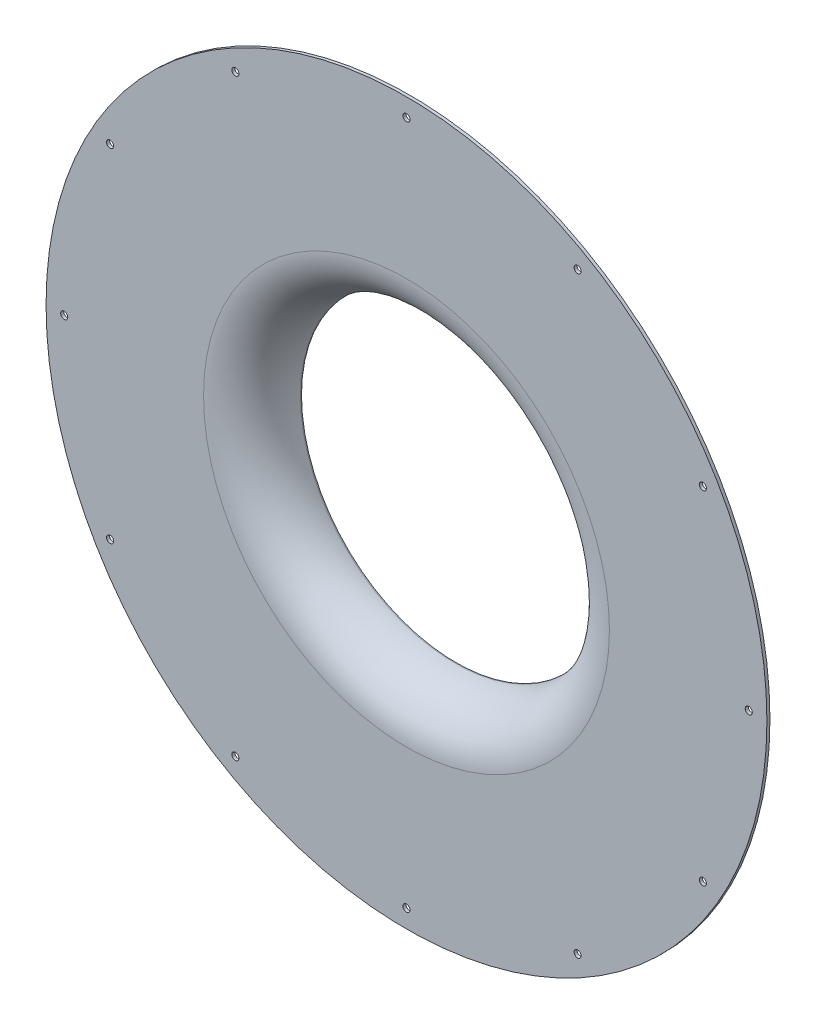
ISO-10303-21;
HEADER;
FILE_DESCRIPTION(('STEP AP214'),'2;1');
FILE_NAME('part.step','',(''),(''),'','','');
FILE_SCHEMA(('AUTOMOTIVE_DESIGN { 1 0 10303 214 1 1 1 1 }'));
ENDSEC;
DATA;
#1=APPLICATION_CONTEXT('core data for automotive mechanical design processes');
#2=APPLICATION_PROTOCOL_DEFINITION('international standard','automotive_design',2000,#1);
#3=PRODUCT_CONTEXT('',#1,'mechanical');
#4=PRODUCT('Part','Part','',(#3));
#5=PRODUCT_RELATED_PRODUCT_CATEGORY('part','',(#4));
#6=PRODUCT_DEFINITION_FORMATION('','',#4);
#7=PRODUCT_DEFINITION_CONTEXT('part definition',#1,'design');
#8=PRODUCT_DEFINITION('design','',#6,#7);
#9=PRODUCT_DEFINITION_SHAPE('','',#8);
#10=(LENGTH_UNIT() NAMED_UNIT(*) SI_UNIT(.MILLI.,.METRE.));
#11=(NAMED_UNIT(*) PLANE_ANGLE_UNIT() SI_UNIT($,.RADIAN.));
#12=(NAMED_UNIT(*) SI_UNIT($,.STERADIAN.) SOLID_ANGLE_UNIT());
#13=UNCERTAINTY_MEASURE_WITH_UNIT(LENGTH_MEASURE(1.E-05),#10,'distance_accuracy_value','');
#14=(GEOMETRIC_REPRESENTATION_CONTEXT(3) GLOBAL_UNCERTAINTY_ASSIGNED_CONTEXT((#13)) GLOBAL_UNIT_ASSIGNED_CONTEXT((#10,
#11,#12)) REPRESENTATION_CONTEXT('',''));
#15=CARTESIAN_POINT('',(0.,0.,0.));
#16=DIRECTION('',(0.,0.,1.));
#17=DIRECTION('',(1.,0.,0.));
#18=AXIS2_PLACEMENT_3D('',#15,#16,#17);
#19=CARTESIAN_POINT('',(0.,0.,-3.));
#20=DIRECTION('',(0.,0.,1.));
#21=DIRECTION('',(1.,0.,0.));
#22=AXIS2_PLACEMENT_3D('',#19,#20,#21);
#23=CYLINDRICAL_SURFACE('',#22,357.);
#24=CARTESIAN_POINT('',(0.,0.,-3.));
#25=DIRECTION('',(0.,0.,1.));
#26=DIRECTION('',(1.,0.,0.));
#27=AXIS2_PLACEMENT_3D('',#24,#25,#26);
#28=CIRCLE('',#27,357.);
#29=CARTESIAN_POINT('',(357.,0.,-3.));
#30=VERTEX_POINT('',#29);
#31=EDGE_CURVE('E104',#30,#30,#28,.T.);
#32=ORIENTED_EDGE('',*,*,#31,.T.);
#33=EDGE_LOOP('',(#32));
#34=FACE_BOUND('',#33,.T.);
#35=CARTESIAN_POINT('',(0.,0.,0.));
#36=DIRECTION('',(0.,0.,1.));
#37=DIRECTION('',(1.,0.,0.));
#38=AXIS2_PLACEMENT_3D('',#35,#36,#37);
#39=CIRCLE('',#38,357.);
#40=CARTESIAN_POINT('',(357.,0.,0.));
#41=VERTEX_POINT('',#40);
#42=EDGE_CURVE('E160',#41,#41,#39,.T.);
#43=ORIENTED_EDGE('',*,*,#42,.F.);
#44=EDGE_LOOP('',(#43));
#45=FACE_BOUND('',#44,.T.);
#46=ADVANCED_FACE('F94',(#34,#45),#23,.T.);
#47=CARTESIAN_POINT('',(0.,0.,-3.));
#48=DIRECTION('',(0.,0.,1.));
#49=DIRECTION('',(1.,0.,0.));
#50=AXIS2_PLACEMENT_3D('',#47,#48,#49);
#51=PLANE('',#50);
#52=CARTESIAN_POINT('',(-293.582611882927,169.499999999996,-3.));
#53=DIRECTION('',(0.,0.,-1.));
#54=DIRECTION('',(-1.,0.,0.));
#55=AXIS2_PLACEMENT_3D('',#52,#53,#54);
#56=CIRCLE('',#55,3.5);
#57=CARTESIAN_POINT('',(-297.082611882927,169.499999999996,-3.));
#58=VERTEX_POINT('',#57);
#59=EDGE_CURVE('E291',#58,#58,#56,.T.);
#60=ORIENTED_EDGE('',*,*,#59,.F.);
#61=EDGE_LOOP('',(#60));
#62=FACE_BOUND('',#61,.T.);
#63=CARTESIAN_POINT('',(-169.500000000003,293.582611882923,-3.));
#64=DIRECTION('',(0.,0.,-1.));
#65=DIRECTION('',(-1.,0.,0.));
#66=AXIS2_PLACEMENT_3D('',#63,#64,#65);
#67=CIRCLE('',#66,3.5);
#68=CARTESIAN_POINT('',(-173.000000000003,293.582611882923,-3.));
#69=VERTEX_POINT('',#68);
#70=EDGE_CURVE('E295',#69,#69,#67,.T.);
#71=ORIENTED_EDGE('',*,*,#70,.F.);
#72=EDGE_LOOP('',(#71));
#73=FACE_BOUND('',#72,.T.);
#74=CARTESIAN_POINT('',(-3.55083857824824E-12,339.,-3.));
#75=DIRECTION('',(0.,0.,-1.));
#76=DIRECTION('',(-1.,0.,0.));
#77=AXIS2_PLACEMENT_3D('',#74,#75,#76);
#78=CIRCLE('',#77,3.49999999999999);
#79=CARTESIAN_POINT('',(-3.50000000000354,339.,-3.));
#80=VERTEX_POINT('',#79);
#81=EDGE_CURVE('E305',#80,#80,#78,.T.);
#82=ORIENTED_EDGE('',*,*,#81,.F.);
#83=EDGE_LOOP('',(#82));
#84=FACE_BOUND('',#83,.T.);
#85=CARTESIAN_POINT('',(169.499999999997,293.582611882926,-3.));
#86=DIRECTION('',(0.,0.,-1.));
#87=DIRECTION('',(-1.,0.,0.));
#88=AXIS2_PLACEMENT_3D('',#85,#86,#87);
#89=CIRCLE('',#88,3.49999999999998);
#90=CARTESIAN_POINT('',(165.999999999997,293.582611882926,-3.));
#91=VERTEX_POINT('',#90);
#92=EDGE_CURVE('E313',#91,#91,#89,.T.);
#93=ORIENTED_EDGE('',*,*,#92,.F.);
#94=EDGE_LOOP('',(#93));
#95=FACE_BOUND('',#94,.T.);
#96=CARTESIAN_POINT('',(293.582611882923,169.500000000002,-3.));
#97=DIRECTION('',(0.,0.,-1.));
#98=DIRECTION('',(-1.,0.,0.));
#99=AXIS2_PLACEMENT_3D('',#96,#97,#98);
#100=CIRCLE('',#99,3.5);
#101=CARTESIAN_POINT('',(290.082611882923,169.500000000002,-3.));
#102=VERTEX_POINT('',#101);
#103=EDGE_CURVE('E321',#102,#102,#100,.T.);
#104=ORIENTED_EDGE('',*,*,#103,.F.);
#105=EDGE_LOOP('',(#104));
#106=FACE_BOUND('',#105,.T.);
#107=CARTESIAN_POINT('',(339.,0.,-3.));
#108=DIRECTION('',(0.,0.,-1.));
#109=DIRECTION('',(-1.,0.,0.));
#110=AXIS2_PLACEMENT_3D('',#107,#108,#109);
#111=CIRCLE('',#110,3.5);
#112=CARTESIAN_POINT('',(335.5,0.,-3.));
#113=VERTEX_POINT('',#112);
#114=EDGE_CURVE('E329',#113,#113,#111,.T.);
#115=ORIENTED_EDGE('',*,*,#114,.F.);
#116=EDGE_LOOP('',(#115));
#117=FACE_BOUND('',#116,.T.);
#118=CARTESIAN_POINT('',(293.582611882926,-169.499999999998,-3.));
#119=DIRECTION('',(0.,0.,-1.));
#120=DIRECTION('',(-1.,0.,0.));
#121=AXIS2_PLACEMENT_3D('',#118,#119,#120);
#122=CIRCLE('',#121,3.5);
#123=CARTESIAN_POINT('',(290.082611882926,-169.499999999998,-3.));
#124=VERTEX_POINT('',#123);
#125=EDGE_CURVE('E337',#124,#124,#122,.T.);
#126=ORIENTED_EDGE('',*,*,#125,.F.);
#127=EDGE_LOOP('',(#126));
#128=FACE_BOUND('',#127,.T.);
#129=CARTESIAN_POINT('',(169.500000000001,-293.582611882924,-3.));
#130=DIRECTION('',(0.,0.,-1.));
#131=DIRECTION('',(-1.,0.,0.));
#132=AXIS2_PLACEMENT_3D('',#129,#130,#131);
#133=CIRCLE('',#132,3.49999999999998);
#134=CARTESIAN_POINT('',(166.000000000001,-293.582611882924,-3.));
#135=VERTEX_POINT('',#134);
#136=EDGE_CURVE('E345',#135,#135,#133,.T.);
#137=ORIENTED_EDGE('',*,*,#136,.F.);
#138=EDGE_LOOP('',(#137));
#139=FACE_BOUND('',#138,.T.);
#140=CARTESIAN_POINT('',(1.18361285941608E-12,-339.,-3.));
#141=DIRECTION('',(0.,0.,-1.));
#142=DIRECTION('',(-1.,0.,0.));
#143=AXIS2_PLACEMENT_3D('',#140,#141,#142);
#144=CIRCLE('',#143,3.49999999999999);
#145=CARTESIAN_POINT('',(-3.49999999999881,-339.,-3.));
#146=VERTEX_POINT('',#145);
#147=EDGE_CURVE('E353',#146,#146,#144,.T.);
#148=ORIENTED_EDGE('',*,*,#147,.F.);
#149=EDGE_LOOP('',(#148));
#150=FACE_BOUND('',#149,.T.);
#151=CARTESIAN_POINT('',(-169.499999999999,-293.582611882925,-3.));
#152=DIRECTION('',(0.,0.,-1.));
#153=DIRECTION('',(-1.,0.,0.));
#154=AXIS2_PLACEMENT_3D('',#151,#152,#153);
#155=CIRCLE('',#154,3.49999999999998);
#156=CARTESIAN_POINT('',(-172.999999999999,-293.582611882925,-3.));
#157=VERTEX_POINT('',#156);
#158=EDGE_CURVE('E361',#157,#157,#155,.T.);
#159=ORIENTED_EDGE('',*,*,#158,.F.);
#160=EDGE_LOOP('',(#159));
#161=FACE_BOUND('',#160,.T.);
#162=CARTESIAN_POINT('',(-293.582611882924,-169.5,-3.));
#163=DIRECTION('',(0.,0.,-1.));
#164=DIRECTION('',(-1.,0.,0.));
#165=AXIS2_PLACEMENT_3D('',#162,#163,#164);
#166=CIRCLE('',#165,3.5);
#167=CARTESIAN_POINT('',(-297.082611882924,-169.5,-3.));
#168=VERTEX_POINT('',#167);
#169=EDGE_CURVE('E189',#168,#168,#166,.T.);
#170=ORIENTED_EDGE('',*,*,#169,.F.);
#171=EDGE_LOOP('',(#170));
#172=FACE_BOUND('',#171,.T.);
#173=CARTESIAN_POINT('',(-339.,0.,-3.));
#174=DIRECTION('',(0.,0.,-1.));
#175=DIRECTION('',(-1.,0.,0.));
#176=AXIS2_PLACEMENT_3D('',#173,#174,#175);
#177=CIRCLE('',#176,3.5);
#178=CARTESIAN_POINT('',(-342.5,0.,-3.));
#179=VERTEX_POINT('',#178);
#180=EDGE_CURVE('E179',#179,#179,#177,.T.);
#181=ORIENTED_EDGE('',*,*,#180,.F.);
#182=EDGE_LOOP('',(#181));
#183=FACE_BOUND('',#182,.T.);
#184=CARTESIAN_POINT('',(0.,0.,-3.));
#185=DIRECTION('',(0.,0.,-1.));
#186=DIRECTION('',(-1.,0.,0.));
#187=AXIS2_PLACEMENT_3D('',#184,#185,#186);
#188=CIRCLE('',#187,201.);
#189=CARTESIAN_POINT('',(-201.,0.,-3.));
#190=VERTEX_POINT('',#189);
#191=EDGE_CURVE('E138',#190,#190,#188,.T.);
#192=ORIENTED_EDGE('',*,*,#191,.F.);
#193=EDGE_LOOP('',(#192));
#194=FACE_BOUND('',#193,.T.);
#195=ORIENTED_EDGE('',*,*,#31,.F.);
#196=EDGE_LOOP('',(#195));
#197=FACE_BOUND('',#196,.T.);
#198=ADVANCED_FACE('F209',(#62,#73,#84,#95,#106,#117,#128,#139,#150,#161,#172,#183,#194,#197),
#51,.F.);
#199=CARTESIAN_POINT('',(0.,0.,0.));
#200=DIRECTION('',(0.,0.,1.));
#201=DIRECTION('',(1.,0.,0.));
#202=AXIS2_PLACEMENT_3D('',#199,#200,#201);
#203=PLANE('',#202);
#204=CARTESIAN_POINT('',(-293.582611882927,169.499999999996,0.));
#205=DIRECTION('',(0.,0.,1.));
#206=DIRECTION('',(1.,0.,0.));
#207=AXIS2_PLACEMENT_3D('',#204,#205,#206);
#208=CIRCLE('',#207,3.5);
#209=CARTESIAN_POINT('',(-290.082611882927,169.499999999996,0.));
#210=VERTEX_POINT('',#209);
#211=EDGE_CURVE('E289',#210,#210,#208,.T.);
#212=ORIENTED_EDGE('',*,*,#211,.F.);
#213=EDGE_LOOP('',(#212));
#214=FACE_BOUND('',#213,.T.);
#215=CARTESIAN_POINT('',(-169.500000000003,293.582611882923,0.));
#216=DIRECTION('',(0.,0.,1.));
#217=DIRECTION('',(1.,0.,0.));
#218=AXIS2_PLACEMENT_3D('',#215,#216,#217);
#219=CIRCLE('',#218,3.49999999999999);
#220=CARTESIAN_POINT('',(-166.000000000003,293.582611882923,0.));
#221=VERTEX_POINT('',#220);
#222=EDGE_CURVE('E301',#221,#221,#219,.T.);
#223=ORIENTED_EDGE('',*,*,#222,.F.);
#224=EDGE_LOOP('',(#223));
#225=FACE_BOUND('',#224,.T.);
#226=CARTESIAN_POINT('',(-3.55083857824824E-12,339.,0.));
#227=DIRECTION('',(0.,0.,1.));
#228=DIRECTION('',(1.,0.,0.));
#229=AXIS2_PLACEMENT_3D('',#226,#227,#228);
#230=CIRCLE('',#229,3.49999999999999);
#231=CARTESIAN_POINT('',(3.49999999999644,339.,0.));
#232=VERTEX_POINT('',#231);
#233=EDGE_CURVE('E309',#232,#232,#230,.T.);
#234=ORIENTED_EDGE('',*,*,#233,.F.);
#235=EDGE_LOOP('',(#234));
#236=FACE_BOUND('',#235,.T.);
#237=CARTESIAN_POINT('',(169.499999999997,293.582611882926,0.));
#238=DIRECTION('',(0.,0.,1.));
#239=DIRECTION('',(1.,0.,0.));
#240=AXIS2_PLACEMENT_3D('',#237,#238,#239);
#241=CIRCLE('',#240,3.49999999999998);
#242=CARTESIAN_POINT('',(172.999999999997,293.582611882926,0.));
#243=VERTEX_POINT('',#242);
#244=EDGE_CURVE('E317',#243,#243,#241,.T.);
#245=ORIENTED_EDGE('',*,*,#244,.F.);
#246=EDGE_LOOP('',(#245));
#247=FACE_BOUND('',#246,.T.);
#248=CARTESIAN_POINT('',(293.582611882923,169.500000000002,0.));
#249=DIRECTION('',(0.,0.,1.));
#250=DIRECTION('',(1.,0.,0.));
#251=AXIS2_PLACEMENT_3D('',#248,#249,#250);
#252=CIRCLE('',#251,3.5);
#253=CARTESIAN_POINT('',(297.082611882923,169.500000000002,0.));
#254=VERTEX_POINT('',#253);
#255=EDGE_CURVE('E325',#254,#254,#252,.T.);
#256=ORIENTED_EDGE('',*,*,#255,.F.);
#257=EDGE_LOOP('',(#256));
#258=FACE_BOUND('',#257,.T.);
#259=CARTESIAN_POINT('',(339.,0.,0.));
#260=DIRECTION('',(0.,0.,1.));
#261=DIRECTION('',(1.,0.,0.));
#262=AXIS2_PLACEMENT_3D('',#259,#260,#261);
#263=CIRCLE('',#262,3.5);
#264=CARTESIAN_POINT('',(342.5,0.,0.));
#265=VERTEX_POINT('',#264);
#266=EDGE_CURVE('E333',#265,#265,#263,.T.);
#267=ORIENTED_EDGE('',*,*,#266,.F.);
#268=EDGE_LOOP('',(#267));
#269=FACE_BOUND('',#268,.T.);
#270=CARTESIAN_POINT('',(293.582611882926,-169.499999999998,0.));
#271=DIRECTION('',(0.,0.,1.));
#272=DIRECTION('',(1.,0.,0.));
#273=AXIS2_PLACEMENT_3D('',#270,#271,#272);
#274=CIRCLE('',#273,3.5);
#275=CARTESIAN_POINT('',(297.082611882926,-169.499999999998,0.));
#276=VERTEX_POINT('',#275);
#277=EDGE_CURVE('E341',#276,#276,#274,.T.);
#278=ORIENTED_EDGE('',*,*,#277,.F.);
#279=EDGE_LOOP('',(#278));
#280=FACE_BOUND('',#279,.T.);
#281=CARTESIAN_POINT('',(169.500000000001,-293.582611882924,0.));
#282=DIRECTION('',(0.,0.,1.));
#283=DIRECTION('',(1.,0.,0.));
#284=AXIS2_PLACEMENT_3D('',#281,#282,#283);
#285=CIRCLE('',#284,3.49999999999998);
#286=CARTESIAN_POINT('',(173.000000000001,-293.582611882924,0.));
#287=VERTEX_POINT('',#286);
#288=EDGE_CURVE('E349',#287,#287,#285,.T.);
#289=ORIENTED_EDGE('',*,*,#288,.F.);
#290=EDGE_LOOP('',(#289));
#291=FACE_BOUND('',#290,.T.);
#292=CARTESIAN_POINT('',(1.18361285941608E-12,-339.,0.));
#293=DIRECTION('',(0.,0.,1.));
#294=DIRECTION('',(1.,0.,0.));
#295=AXIS2_PLACEMENT_3D('',#292,#293,#294);
#296=CIRCLE('',#295,3.49999999999999);
#297=CARTESIAN_POINT('',(3.50000000000117,-339.,0.));
#298=VERTEX_POINT('',#297);
#299=EDGE_CURVE('E357',#298,#298,#296,.T.);
#300=ORIENTED_EDGE('',*,*,#299,.F.);
#301=EDGE_LOOP('',(#300));
#302=FACE_BOUND('',#301,.T.);
#303=CARTESIAN_POINT('',(-169.499999999999,-293.582611882925,0.));
#304=DIRECTION('',(0.,0.,1.));
#305=DIRECTION('',(1.,0.,0.));
#306=AXIS2_PLACEMENT_3D('',#303,#304,#305);
#307=CIRCLE('',#306,3.49999999999998);
#308=CARTESIAN_POINT('',(-165.999999999999,-293.582611882925,0.));
#309=VERTEX_POINT('',#308);
#310=EDGE_CURVE('E364',#309,#309,#307,.T.);
#311=ORIENTED_EDGE('',*,*,#310,.F.);
#312=EDGE_LOOP('',(#311));
#313=FACE_BOUND('',#312,.T.);
#314=CARTESIAN_POINT('',(-293.582611882924,-169.5,0.));
#315=DIRECTION('',(0.,0.,1.));
#316=DIRECTION('',(1.,0.,0.));
#317=AXIS2_PLACEMENT_3D('',#314,#315,#316);
#318=CIRCLE('',#317,3.5);
#319=CARTESIAN_POINT('',(-290.082611882924,-169.5,0.));
#320=VERTEX_POINT('',#319);
#321=EDGE_CURVE('E97',#320,#320,#318,.T.);
#322=ORIENTED_EDGE('',*,*,#321,.F.);
#323=EDGE_LOOP('',(#322));
#324=FACE_BOUND('',#323,.T.);
#325=CARTESIAN_POINT('',(-339.,0.,0.));
#326=DIRECTION('',(0.,0.,1.));
#327=DIRECTION('',(1.,0.,0.));
#328=AXIS2_PLACEMENT_3D('',#325,#326,#327);
#329=CIRCLE('',#328,3.5);
#330=CARTESIAN_POINT('',(-335.5,0.,0.));
#331=VERTEX_POINT('',#330);
#332=EDGE_CURVE('E150',#331,#331,#329,.T.);
#333=ORIENTED_EDGE('',*,*,#332,.F.);
#334=EDGE_LOOP('',(#333));
#335=FACE_BOUND('',#334,.T.);
#336=CARTESIAN_POINT('',(0.,0.,0.));
#337=DIRECTION('',(0.,0.,1.));
#338=DIRECTION('',(1.,0.,0.));
#339=AXIS2_PLACEMENT_3D('',#336,#337,#338);
#340=CIRCLE('',#339,201.);
#341=CARTESIAN_POINT('',(-201.,0.,0.));
#342=VERTEX_POINT('',#341);
#343=EDGE_CURVE('E12',#342,#342,#340,.T.);
#344=ORIENTED_EDGE('',*,*,#343,.F.);
#345=EDGE_LOOP('',(#344));
#346=FACE_BOUND('',#345,.T.);
#347=ORIENTED_EDGE('',*,*,#42,.T.);
#348=EDGE_LOOP('',(#347));
#349=FACE_BOUND('',#348,.T.);
#350=ADVANCED_FACE('F206',(#214,#225,#236,#247,#258,#269,#280,#291,#302,#313,#324,#335,#346,
#349),#203,.T.);
#351=CARTESIAN_POINT('',(0.,0.,-49.));
#352=DIRECTION('',(0.,0.,1.));
#353=DIRECTION('',(1.,0.,0.));
#354=AXIS2_PLACEMENT_3D('',#351,#352,#353);
#355=PLANE('',#354);
#356=CARTESIAN_POINT('',(0.,0.,-49.));
#357=DIRECTION('',(0.,0.,-1.));
#358=DIRECTION('',(-1.,0.,0.));
#359=AXIS2_PLACEMENT_3D('',#356,#357,#358);
#360=CIRCLE('',#359,156.);
#361=CARTESIAN_POINT('',(-156.,0.,-49.));
#362=VERTEX_POINT('',#361);
#363=EDGE_CURVE('E134',#362,#362,#360,.T.);
#364=ORIENTED_EDGE('',*,*,#363,.T.);
#365=EDGE_LOOP('',(#364));
#366=FACE_BOUND('',#365,.T.);
#367=CARTESIAN_POINT('',(0.,0.,-49.));
#368=DIRECTION('',(0.,0.,-1.));
#369=DIRECTION('',(-1.,0.,0.));
#370=AXIS2_PLACEMENT_3D('',#367,#368,#369);
#371=CIRCLE('',#370,153.);
#372=CARTESIAN_POINT('',(-153.,0.,-49.));
#373=VERTEX_POINT('',#372);
#374=EDGE_CURVE('E135',#373,#373,#371,.T.);
#375=ORIENTED_EDGE('',*,*,#374,.F.);
#376=EDGE_LOOP('',(#375));
#377=FACE_BOUND('',#376,.T.);
#378=ADVANCED_FACE('F132',(#366,#377),#355,.F.);
#379=CARTESIAN_POINT('',(0.,0.,-3.));
#380=DIRECTION('',(0.,0.,-1.));
#381=DIRECTION('',(-1.,0.,0.));
#382=AXIS2_PLACEMENT_3D('',#379,#380,#381);
#383=CYLINDRICAL_SURFACE('',#382,153.);
#384=DIRECTION('',(0.,0.,-1.));
#385=VECTOR('',#384,1.);
#386=CARTESIAN_POINT('',(-153.,0.,-3.));
#387=LINE('',#386,#385);
#388=CARTESIAN_POINT('',(-153.,0.,-48.0000000000002));
#389=VERTEX_POINT('',#388);
#390=EDGE_CURVE('E173',#389,#373,#387,.T.);
#391=ORIENTED_EDGE('',*,*,#390,.F.);
#392=CARTESIAN_POINT('',(0.,0.,-48.0000000000002));
#393=DIRECTION('',(0.,0.,-1.));
#394=DIRECTION('',(-1.,0.,0.));
#395=AXIS2_PLACEMENT_3D('',#392,#393,#394);
#396=CIRCLE('',#395,153.);
#397=EDGE_CURVE('E195',#389,#389,#396,.T.);
#398=ORIENTED_EDGE('',*,*,#397,.F.);
#399=ORIENTED_EDGE('',*,*,#390,.T.);
#400=ORIENTED_EDGE('',*,*,#374,.T.);
#401=EDGE_LOOP('',(#391,#398,#399,#400));
#402=FACE_BOUND('',#401,.T.);
#403=ADVANCED_FACE('F200',(#402),#383,.F.);
#404=CARTESIAN_POINT('',(0.,0.,-48.));
#405=DIRECTION('',(0.,0.,-1.));
#406=DIRECTION('',(-1.,0.,0.));
#407=AXIS2_PLACEMENT_3D('',#404,#405,#406);
#408=TOROIDAL_SURFACE('',#407,201.,48.);
#409=CARTESIAN_POINT('',(-201.,0.,-48.));
#410=DIRECTION('',(0.,-1.,0.));
#411=DIRECTION('',(0.,0.,-1.));
#412=AXIS2_PLACEMENT_3D('',#409,#410,#411);
#413=CIRCLE('',#412,48.);
#414=EDGE_CURVE('E155',#342,#389,#413,.F.);
#415=ORIENTED_EDGE('',*,*,#414,.F.);
#416=ORIENTED_EDGE('',*,*,#343,.T.);
#417=ORIENTED_EDGE('',*,*,#414,.T.);
#418=ORIENTED_EDGE('',*,*,#397,.T.);
#419=EDGE_LOOP('',(#415,#416,#417,#418));
#420=FACE_BOUND('',#419,.T.);
#421=ADVANCED_FACE('F204',(#420),#408,.T.);
#422=CARTESIAN_POINT('',(0.,0.,-3.));
#423=DIRECTION('',(0.,0.,-1.));
#424=DIRECTION('',(-1.,0.,0.));
#425=AXIS2_PLACEMENT_3D('',#422,#423,#424);
#426=CYLINDRICAL_SURFACE('',#425,156.);
#427=DIRECTION('',(0.,0.,-1.));
#428=VECTOR('',#427,1.);
#429=CARTESIAN_POINT('',(-156.,0.,-3.));
#430=LINE('',#429,#428);
#431=CARTESIAN_POINT('',(-156.,0.,-48.0000000000002));
#432=VERTEX_POINT('',#431);
#433=EDGE_CURVE('E142',#432,#362,#430,.T.);
#434=ORIENTED_EDGE('',*,*,#433,.T.);
#435=ORIENTED_EDGE('',*,*,#363,.F.);
#436=ORIENTED_EDGE('',*,*,#433,.F.);
#437=CARTESIAN_POINT('',(0.,0.,-48.0000000000002));
#438=DIRECTION('',(0.,0.,-1.));
#439=DIRECTION('',(-1.,0.,0.));
#440=AXIS2_PLACEMENT_3D('',#437,#438,#439);
#441=CIRCLE('',#440,156.);
#442=EDGE_CURVE('E144',#432,#432,#441,.T.);
#443=ORIENTED_EDGE('',*,*,#442,.T.);
#444=EDGE_LOOP('',(#434,#435,#436,#443));
#445=FACE_BOUND('',#444,.T.);
#446=ADVANCED_FACE('F143',(#445),#426,.T.);
#447=CARTESIAN_POINT('',(0.,0.,-48.));
#448=DIRECTION('',(0.,0.,-1.));
#449=DIRECTION('',(-1.,0.,0.));
#450=AXIS2_PLACEMENT_3D('',#447,#448,#449);
#451=TOROIDAL_SURFACE('',#450,201.,45.);
#452=CARTESIAN_POINT('',(-201.,0.,-48.));
#453=DIRECTION('',(0.,-1.,0.));
#454=DIRECTION('',(0.,0.,-1.));
#455=AXIS2_PLACEMENT_3D('',#452,#453,#454);
#456=CIRCLE('',#455,45.);
#457=EDGE_CURVE('E129',#190,#432,#456,.F.);
#458=ORIENTED_EDGE('',*,*,#457,.T.);
#459=ORIENTED_EDGE('',*,*,#442,.F.);
#460=ORIENTED_EDGE('',*,*,#457,.F.);
#461=ORIENTED_EDGE('',*,*,#191,.T.);
#462=EDGE_LOOP('',(#458,#459,#460,#461));
#463=FACE_BOUND('',#462,.T.);
#464=ADVANCED_FACE('F231',(#463),#451,.F.);
#465=CARTESIAN_POINT('',(-339.,0.,-3.));
#466=DIRECTION('',(0.,0.,-1.));
#467=DIRECTION('',(-1.,0.,0.));
#468=AXIS2_PLACEMENT_3D('',#465,#466,#467);
#469=CYLINDRICAL_SURFACE('',#468,3.5);
#470=ORIENTED_EDGE('',*,*,#332,.T.);
#471=EDGE_LOOP('',(#470));
#472=FACE_BOUND('',#471,.T.);
#473=ORIENTED_EDGE('',*,*,#180,.T.);
#474=EDGE_LOOP('',(#473));
#475=FACE_BOUND('',#474,.T.);
#476=ADVANCED_FACE('F234',(#472,#475),#469,.F.);
#477=CARTESIAN_POINT('',(-293.582611882924,-169.5,-3.));
#478=DIRECTION('',(0.,0.,-1.));
#479=DIRECTION('',(-1.,0.,0.));
#480=AXIS2_PLACEMENT_3D('',#477,#478,#479);
#481=CYLINDRICAL_SURFACE('',#480,3.5);
#482=ORIENTED_EDGE('',*,*,#321,.T.);
#483=EDGE_LOOP('',(#482));
#484=FACE_BOUND('',#483,.T.);
#485=ORIENTED_EDGE('',*,*,#169,.T.);
#486=EDGE_LOOP('',(#485));
#487=FACE_BOUND('',#486,.T.);
#488=ADVANCED_FACE('F241',(#484,#487),#481,.F.);
#489=CARTESIAN_POINT('',(-169.499999999999,-293.582611882925,-3.));
#490=DIRECTION('',(0.,0.,-1.));
#491=DIRECTION('',(-1.,0.,0.));
#492=AXIS2_PLACEMENT_3D('',#489,#490,#491);
#493=CYLINDRICAL_SURFACE('',#492,3.49999999999998);
#494=ORIENTED_EDGE('',*,*,#310,.T.);
#495=EDGE_LOOP('',(#494));
#496=FACE_BOUND('',#495,.T.);
#497=ORIENTED_EDGE('',*,*,#158,.T.);
#498=EDGE_LOOP('',(#497));
#499=FACE_BOUND('',#498,.T.);
#500=ADVANCED_FACE('F244',(#496,#499),#493,.F.);
#501=CARTESIAN_POINT('',(1.18361285941608E-12,-339.,-3.));
#502=DIRECTION('',(0.,0.,-1.));
#503=DIRECTION('',(-1.,0.,0.));
#504=AXIS2_PLACEMENT_3D('',#501,#502,#503);
#505=CYLINDRICAL_SURFACE('',#504,3.49999999999999);
#506=ORIENTED_EDGE('',*,*,#299,.T.);
#507=EDGE_LOOP('',(#506));
#508=FACE_BOUND('',#507,.T.);
#509=ORIENTED_EDGE('',*,*,#147,.T.);
#510=EDGE_LOOP('',(#509));
#511=FACE_BOUND('',#510,.T.);
#512=ADVANCED_FACE('F248',(#508,#511),#505,.F.);
#513=CARTESIAN_POINT('',(169.500000000001,-293.582611882924,-3.));
#514=DIRECTION('',(0.,0.,-1.));
#515=DIRECTION('',(-1.,0.,0.));
#516=AXIS2_PLACEMENT_3D('',#513,#514,#515);
#517=CYLINDRICAL_SURFACE('',#516,3.49999999999998);
#518=ORIENTED_EDGE('',*,*,#288,.T.);
#519=EDGE_LOOP('',(#518));
#520=FACE_BOUND('',#519,.T.);
#521=ORIENTED_EDGE('',*,*,#136,.T.);
#522=EDGE_LOOP('',(#521));
#523=FACE_BOUND('',#522,.T.);
#524=ADVANCED_FACE('F252',(#520,#523),#517,.F.);
#525=CARTESIAN_POINT('',(293.582611882926,-169.499999999998,-3.));
#526=DIRECTION('',(0.,0.,-1.));
#527=DIRECTION('',(-1.,0.,0.));
#528=AXIS2_PLACEMENT_3D('',#525,#526,#527);
#529=CYLINDRICAL_SURFACE('',#528,3.5);
#530=ORIENTED_EDGE('',*,*,#277,.T.);
#531=EDGE_LOOP('',(#530));
#532=FACE_BOUND('',#531,.T.);
#533=ORIENTED_EDGE('',*,*,#125,.T.);
#534=EDGE_LOOP('',(#533));
#535=FACE_BOUND('',#534,.T.);
#536=ADVANCED_FACE('F256',(#532,#535),#529,.F.);
#537=CARTESIAN_POINT('',(339.,0.,-3.));
#538=DIRECTION('',(0.,0.,-1.));
#539=DIRECTION('',(-1.,0.,0.));
#540=AXIS2_PLACEMENT_3D('',#537,#538,#539);
#541=CYLINDRICAL_SURFACE('',#540,3.5);
#542=ORIENTED_EDGE('',*,*,#266,.T.);
#543=EDGE_LOOP('',(#542));
#544=FACE_BOUND('',#543,.T.);
#545=ORIENTED_EDGE('',*,*,#114,.T.);
#546=EDGE_LOOP('',(#545));
#547=FACE_BOUND('',#546,.T.);
#548=ADVANCED_FACE('F260',(#544,#547),#541,.F.);
#549=CARTESIAN_POINT('',(293.582611882923,169.500000000002,-3.));
#550=DIRECTION('',(0.,0.,-1.));
#551=DIRECTION('',(-1.,0.,0.));
#552=AXIS2_PLACEMENT_3D('',#549,#550,#551);
#553=CYLINDRICAL_SURFACE('',#552,3.5);
#554=ORIENTED_EDGE('',*,*,#255,.T.);
#555=EDGE_LOOP('',(#554));
#556=FACE_BOUND('',#555,.T.);
#557=ORIENTED_EDGE('',*,*,#103,.T.);
#558=EDGE_LOOP('',(#557));
#559=FACE_BOUND('',#558,.T.);
#560=ADVANCED_FACE('F264',(#556,#559),#553,.F.);
#561=CARTESIAN_POINT('',(169.499999999997,293.582611882926,-3.));
#562=DIRECTION('',(0.,0.,-1.));
#563=DIRECTION('',(-1.,0.,0.));
#564=AXIS2_PLACEMENT_3D('',#561,#562,#563);
#565=CYLINDRICAL_SURFACE('',#564,3.49999999999998);
#566=ORIENTED_EDGE('',*,*,#244,.T.);
#567=EDGE_LOOP('',(#566));
#568=FACE_BOUND('',#567,.T.);
#569=ORIENTED_EDGE('',*,*,#92,.T.);
#570=EDGE_LOOP('',(#569));
#571=FACE_BOUND('',#570,.T.);
#572=ADVANCED_FACE('F268',(#568,#571),#565,.F.);
#573=CARTESIAN_POINT('',(-3.55083857824824E-12,339.,-3.));
#574=DIRECTION('',(0.,0.,-1.));
#575=DIRECTION('',(-1.,0.,0.));
#576=AXIS2_PLACEMENT_3D('',#573,#574,#575);
#577=CYLINDRICAL_SURFACE('',#576,3.49999999999999);
#578=ORIENTED_EDGE('',*,*,#233,.T.);
#579=EDGE_LOOP('',(#578));
#580=FACE_BOUND('',#579,.T.);
#581=ORIENTED_EDGE('',*,*,#81,.T.);
#582=EDGE_LOOP('',(#581));
#583=FACE_BOUND('',#582,.T.);
#584=ADVANCED_FACE('F272',(#580,#583),#577,.F.);
#585=CARTESIAN_POINT('',(-169.500000000003,293.582611882923,-3.));
#586=DIRECTION('',(0.,0.,-1.));
#587=DIRECTION('',(-1.,0.,0.));
#588=AXIS2_PLACEMENT_3D('',#585,#586,#587);
#589=CYLINDRICAL_SURFACE('',#588,3.49999999999999);
#590=ORIENTED_EDGE('',*,*,#222,.T.);
#591=EDGE_LOOP('',(#590));
#592=FACE_BOUND('',#591,.T.);
#593=ORIENTED_EDGE('',*,*,#70,.T.);
#594=EDGE_LOOP('',(#593));
#595=FACE_BOUND('',#594,.T.);
#596=ADVANCED_FACE('F276',(#592,#595),#589,.F.);
#597=CARTESIAN_POINT('',(-293.582611882927,169.499999999996,-3.));
#598=DIRECTION('',(0.,0.,-1.));
#599=DIRECTION('',(-1.,0.,0.));
#600=AXIS2_PLACEMENT_3D('',#597,#598,#599);
#601=CYLINDRICAL_SURFACE('',#600,3.5);
#602=ORIENTED_EDGE('',*,*,#211,.T.);
#603=EDGE_LOOP('',(#602));
#604=FACE_BOUND('',#603,.T.);
#605=ORIENTED_EDGE('',*,*,#59,.T.);
#606=EDGE_LOOP('',(#605));
#607=FACE_BOUND('',#606,.T.);
#608=ADVANCED_FACE('F280',(#604,#607),#601,.F.);
#609=CLOSED_SHELL('',(#46,#198,#350,#378,#403,#421,#446,#464,#476,#488,#500,#512,#524,#536,#548,
#560,#572,#584,#596,#608));
#610=MANIFOLD_SOLID_BREP('B2',#609);
#611=ADVANCED_BREP_SHAPE_REPRESENTATION('',(#18,#610),#14);
#612=SHAPE_DEFINITION_REPRESENTATION(#9,#611);
ENDSEC;
END-ISO-10303-21;
